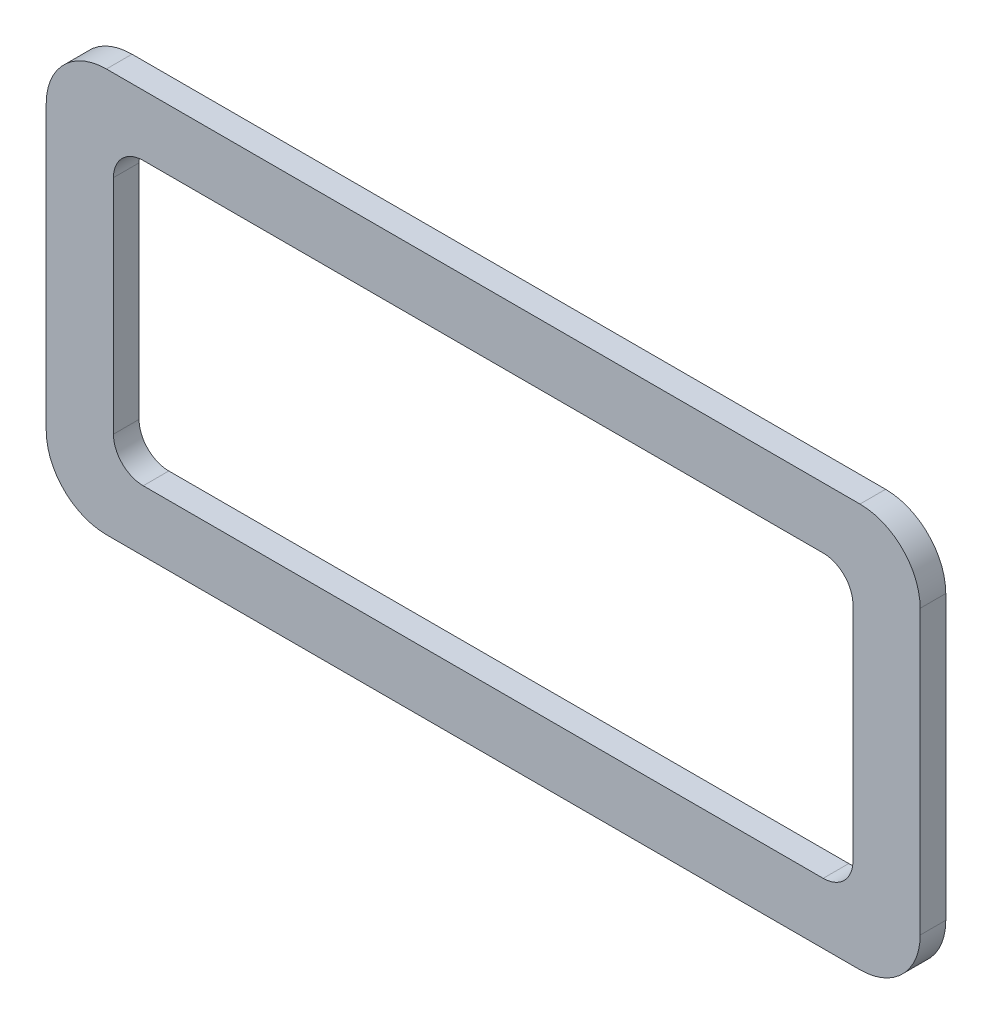
ISO-10303-21;
HEADER;
FILE_DESCRIPTION(('STEP AP214'),'2;1');
FILE_NAME('part.step','',(''),(''),'','','');
FILE_SCHEMA(('AUTOMOTIVE_DESIGN { 1 0 10303 214 1 1 1 1 }'));
ENDSEC;
DATA;
#1=APPLICATION_CONTEXT('core data for automotive mechanical design processes');
#2=APPLICATION_PROTOCOL_DEFINITION('international standard','automotive_design',2000,#1);
#3=PRODUCT_CONTEXT('',#1,'mechanical');
#4=PRODUCT('Part','Part','',(#3));
#5=PRODUCT_RELATED_PRODUCT_CATEGORY('part','',(#4));
#6=PRODUCT_DEFINITION_FORMATION('','',#4);
#7=PRODUCT_DEFINITION_CONTEXT('part definition',#1,'design');
#8=PRODUCT_DEFINITION('design','',#6,#7);
#9=PRODUCT_DEFINITION_SHAPE('','',#8);
#10=(LENGTH_UNIT() NAMED_UNIT(*) SI_UNIT(.MILLI.,.METRE.));
#11=(NAMED_UNIT(*) PLANE_ANGLE_UNIT() SI_UNIT($,.RADIAN.));
#12=(NAMED_UNIT(*) SI_UNIT($,.STERADIAN.) SOLID_ANGLE_UNIT());
#13=UNCERTAINTY_MEASURE_WITH_UNIT(LENGTH_MEASURE(1.E-05),#10,'distance_accuracy_value','');
#14=(GEOMETRIC_REPRESENTATION_CONTEXT(3) GLOBAL_UNCERTAINTY_ASSIGNED_CONTEXT((#13)) GLOBAL_UNIT_ASSIGNED_CONTEXT((#10,
#11,#12)) REPRESENTATION_CONTEXT('',''));
#15=CARTESIAN_POINT('',(0.,0.,0.));
#16=DIRECTION('',(0.,0.,1.));
#17=DIRECTION('',(1.,0.,0.));
#18=AXIS2_PLACEMENT_3D('',#15,#16,#17);
#19=CARTESIAN_POINT('',(-29.8958,11.2268,2.032));
#20=DIRECTION('',(0.,0.,-1.));
#21=DIRECTION('',(-1.,0.,0.));
#22=AXIS2_PLACEMENT_3D('',#19,#20,#21);
#23=PLANE('',#22);
#24=DIRECTION('',(1.,0.,0.));
#25=VECTOR('',#24,1.);
#26=CARTESIAN_POINT('',(-26.9748,11.176,2.032));
#27=LINE('',#26,#25);
#28=CARTESIAN_POINT('',(26.9748,11.176,2.032));
#29=VERTEX_POINT('',#28);
#30=CARTESIAN_POINT('',(-26.9748,11.176,2.032));
#31=VERTEX_POINT('',#30);
#32=EDGE_CURVE('E150',#29,#31,#27,.F.);
#33=ORIENTED_EDGE('',*,*,#32,.F.);
#34=CARTESIAN_POINT('',(26.9748,8.81379999999998,2.032));
#35=DIRECTION('',(0.,0.,-1.));
#36=DIRECTION('',(-1.,0.,0.));
#37=AXIS2_PLACEMENT_3D('',#34,#35,#36);
#38=CIRCLE('',#37,2.36220000000001);
#39=CARTESIAN_POINT('',(29.337,8.81379999999998,2.032));
#40=VERTEX_POINT('',#39);
#41=EDGE_CURVE('E192',#29,#40,#38,.T.);
#42=ORIENTED_EDGE('',*,*,#41,.T.);
#43=DIRECTION('',(0.,1.,0.));
#44=VECTOR('',#43,1.);
#45=CARTESIAN_POINT('',(29.337,8.81379999999998,2.032));
#46=LINE('',#45,#44);
#47=CARTESIAN_POINT('',(29.337,-8.81379999999998,2.032));
#48=VERTEX_POINT('',#47);
#49=EDGE_CURVE('E220',#48,#40,#46,.T.);
#50=ORIENTED_EDGE('',*,*,#49,.F.);
#51=CARTESIAN_POINT('',(26.9748,-8.81379999999998,2.032));
#52=DIRECTION('',(0.,0.,-1.));
#53=DIRECTION('',(-1.,0.,0.));
#54=AXIS2_PLACEMENT_3D('',#51,#52,#53);
#55=CIRCLE('',#54,2.36220000000001);
#56=CARTESIAN_POINT('',(26.9748,-11.176,2.032));
#57=VERTEX_POINT('',#56);
#58=EDGE_CURVE('E195',#48,#57,#55,.T.);
#59=ORIENTED_EDGE('',*,*,#58,.T.);
#60=DIRECTION('',(-1.,0.,0.));
#61=VECTOR('',#60,1.);
#62=CARTESIAN_POINT('',(-26.9748,-11.176,2.032));
#63=LINE('',#62,#61);
#64=CARTESIAN_POINT('',(-26.9748,-11.176,2.032));
#65=VERTEX_POINT('',#64);
#66=EDGE_CURVE('E198',#65,#57,#63,.F.);
#67=ORIENTED_EDGE('',*,*,#66,.F.);
#68=CARTESIAN_POINT('',(-26.9748,-8.81380000000001,2.032));
#69=DIRECTION('',(0.,0.,-1.));
#70=DIRECTION('',(-1.,0.,0.));
#71=AXIS2_PLACEMENT_3D('',#68,#69,#70);
#72=CIRCLE('',#71,2.3622);
#73=CARTESIAN_POINT('',(-29.337,-8.81380000000001,2.032));
#74=VERTEX_POINT('',#73);
#75=EDGE_CURVE('E199',#65,#74,#72,.T.);
#76=ORIENTED_EDGE('',*,*,#75,.T.);
#77=DIRECTION('',(0.,1.,0.));
#78=VECTOR('',#77,1.);
#79=CARTESIAN_POINT('',(-29.337,8.81380000000001,2.032));
#80=LINE('',#79,#78);
#81=CARTESIAN_POINT('',(-29.337,8.81380000000001,2.032));
#82=VERTEX_POINT('',#81);
#83=EDGE_CURVE('E154',#82,#74,#80,.F.);
#84=ORIENTED_EDGE('',*,*,#83,.F.);
#85=CARTESIAN_POINT('',(-26.9748,8.81380000000001,2.032));
#86=DIRECTION('',(0.,0.,-1.));
#87=DIRECTION('',(-1.,0.,0.));
#88=AXIS2_PLACEMENT_3D('',#85,#86,#87);
#89=CIRCLE('',#88,2.3622);
#90=EDGE_CURVE('E202',#82,#31,#89,.T.);
#91=ORIENTED_EDGE('',*,*,#90,.T.);
#92=EDGE_LOOP('',(#33,#42,#50,#59,#67,#76,#84,#91));
#93=FACE_BOUND('',#92,.T.);
#94=DIRECTION('',(0.,1.,0.));
#95=VECTOR('',#94,1.);
#96=CARTESIAN_POINT('',(-34.671,11.2268,2.032));
#97=LINE('',#96,#95);
#98=CARTESIAN_POINT('',(-34.671,11.2268,2.032));
#99=VERTEX_POINT('',#98);
#100=CARTESIAN_POINT('',(-34.671,-11.2268,2.032));
#101=VERTEX_POINT('',#100);
#102=EDGE_CURVE('E130',#99,#101,#97,.F.);
#103=ORIENTED_EDGE('',*,*,#102,.T.);
#104=CARTESIAN_POINT('',(-29.8958,-11.2268,2.032));
#105=DIRECTION('',(0.,0.,-1.));
#106=DIRECTION('',(-1.,0.,0.));
#107=AXIS2_PLACEMENT_3D('',#104,#105,#106);
#108=CIRCLE('',#107,4.7752);
#109=CARTESIAN_POINT('',(-29.8958,-16.002,2.032));
#110=VERTEX_POINT('',#109);
#111=EDGE_CURVE('E144',#110,#101,#108,.T.);
#112=ORIENTED_EDGE('',*,*,#111,.F.);
#113=DIRECTION('',(-1.,0.,0.));
#114=VECTOR('',#113,1.);
#115=CARTESIAN_POINT('',(-29.8958,-16.002,2.032));
#116=LINE('',#115,#114);
#117=CARTESIAN_POINT('',(29.8958,-16.002,2.032));
#118=VERTEX_POINT('',#117);
#119=EDGE_CURVE('E156',#110,#118,#116,.F.);
#120=ORIENTED_EDGE('',*,*,#119,.T.);
#121=CARTESIAN_POINT('',(29.8958,-11.2268,2.032));
#122=DIRECTION('',(0.,0.,-1.));
#123=DIRECTION('',(-1.,0.,0.));
#124=AXIS2_PLACEMENT_3D('',#121,#122,#123);
#125=CIRCLE('',#124,4.77520000000001);
#126=CARTESIAN_POINT('',(34.671,-11.2268,2.032));
#127=VERTEX_POINT('',#126);
#128=EDGE_CURVE('E159',#127,#118,#125,.T.);
#129=ORIENTED_EDGE('',*,*,#128,.F.);
#130=DIRECTION('',(0.,1.,0.));
#131=VECTOR('',#130,1.);
#132=CARTESIAN_POINT('',(34.671,11.2268,2.032));
#133=LINE('',#132,#131);
#134=CARTESIAN_POINT('',(34.671,11.2268,2.032));
#135=VERTEX_POINT('',#134);
#136=EDGE_CURVE('E160',#127,#135,#133,.T.);
#137=ORIENTED_EDGE('',*,*,#136,.T.);
#138=CARTESIAN_POINT('',(29.8958,11.2268,2.032));
#139=DIRECTION('',(0.,0.,-1.));
#140=DIRECTION('',(-1.,0.,0.));
#141=AXIS2_PLACEMENT_3D('',#138,#139,#140);
#142=CIRCLE('',#141,4.77520000000001);
#143=CARTESIAN_POINT('',(29.8958,16.002,2.032));
#144=VERTEX_POINT('',#143);
#145=EDGE_CURVE('E163',#144,#135,#142,.T.);
#146=ORIENTED_EDGE('',*,*,#145,.F.);
#147=DIRECTION('',(1.,0.,0.));
#148=VECTOR('',#147,1.);
#149=CARTESIAN_POINT('',(-29.8958,16.002,2.032));
#150=LINE('',#149,#148);
#151=CARTESIAN_POINT('',(-29.8958,16.002,2.032));
#152=VERTEX_POINT('',#151);
#153=EDGE_CURVE('E133',#144,#152,#150,.F.);
#154=ORIENTED_EDGE('',*,*,#153,.T.);
#155=CARTESIAN_POINT('',(-29.8958,11.2268,2.032));
#156=DIRECTION('',(0.,0.,-1.));
#157=DIRECTION('',(-1.,0.,0.));
#158=AXIS2_PLACEMENT_3D('',#155,#156,#157);
#159=CIRCLE('',#158,4.7752);
#160=EDGE_CURVE('E19',#99,#152,#159,.T.);
#161=ORIENTED_EDGE('',*,*,#160,.F.);
#162=EDGE_LOOP('',(#103,#112,#120,#129,#137,#146,#154,#161));
#163=FACE_BOUND('',#162,.T.);
#164=ADVANCED_FACE('F16',(#93,#163),#23,.F.);
#165=CARTESIAN_POINT('',(-29.8958,11.2268,2.032));
#166=DIRECTION('',(0.,0.,-1.));
#167=DIRECTION('',(-1.,0.,0.));
#168=AXIS2_PLACEMENT_3D('',#165,#166,#167);
#169=CYLINDRICAL_SURFACE('',#168,4.7752);
#170=ORIENTED_EDGE('',*,*,#160,.T.);
#171=DIRECTION('',(0.,0.,1.));
#172=VECTOR('',#171,1.);
#173=CARTESIAN_POINT('',(-29.8958,16.002,2.032));
#174=LINE('',#173,#172);
#175=CARTESIAN_POINT('',(-29.8958,16.002,0.));
#176=VERTEX_POINT('',#175);
#177=EDGE_CURVE('E164',#152,#176,#174,.F.);
#178=ORIENTED_EDGE('',*,*,#177,.T.);
#179=CARTESIAN_POINT('',(-29.8958,11.2268,0.));
#180=DIRECTION('',(0.,0.,-1.));
#181=DIRECTION('',(-1.,0.,0.));
#182=AXIS2_PLACEMENT_3D('',#179,#180,#181);
#183=CIRCLE('',#182,4.7752);
#184=CARTESIAN_POINT('',(-34.671,11.2268,0.));
#185=VERTEX_POINT('',#184);
#186=EDGE_CURVE('E140',#185,#176,#183,.T.);
#187=ORIENTED_EDGE('',*,*,#186,.F.);
#188=DIRECTION('',(0.,0.,-1.));
#189=VECTOR('',#188,1.);
#190=CARTESIAN_POINT('',(-34.671,11.2268,2.032));
#191=LINE('',#190,#189);
#192=EDGE_CURVE('E137',#185,#99,#191,.F.);
#193=ORIENTED_EDGE('',*,*,#192,.T.);
#194=EDGE_LOOP('',(#170,#178,#187,#193));
#195=FACE_BOUND('',#194,.T.);
#196=ADVANCED_FACE('F138',(#195),#169,.T.);
#197=CARTESIAN_POINT('',(-29.8958,16.002,2.032));
#198=DIRECTION('',(0.,-1.,0.));
#199=DIRECTION('',(1.,0.,0.));
#200=AXIS2_PLACEMENT_3D('',#197,#198,#199);
#201=PLANE('',#200);
#202=ORIENTED_EDGE('',*,*,#177,.F.);
#203=ORIENTED_EDGE('',*,*,#153,.F.);
#204=DIRECTION('',(0.,0.,-1.));
#205=VECTOR('',#204,1.);
#206=CARTESIAN_POINT('',(29.8958,16.002,2.032));
#207=LINE('',#206,#205);
#208=CARTESIAN_POINT('',(29.8958,16.002,0.));
#209=VERTEX_POINT('',#208);
#210=EDGE_CURVE('E210',#209,#144,#207,.F.);
#211=ORIENTED_EDGE('',*,*,#210,.F.);
#212=DIRECTION('',(-1.,0.,0.));
#213=VECTOR('',#212,1.);
#214=CARTESIAN_POINT('',(-29.8958,16.002,0.));
#215=LINE('',#214,#213);
#216=EDGE_CURVE('E190',#176,#209,#215,.F.);
#217=ORIENTED_EDGE('',*,*,#216,.F.);
#218=EDGE_LOOP('',(#202,#203,#211,#217));
#219=FACE_BOUND('',#218,.T.);
#220=ADVANCED_FACE('F393',(#219),#201,.F.);
#221=CARTESIAN_POINT('',(29.8958,11.2268,2.032));
#222=DIRECTION('',(0.,0.,-1.));
#223=DIRECTION('',(-1.,0.,0.));
#224=AXIS2_PLACEMENT_3D('',#221,#222,#223);
#225=CYLINDRICAL_SURFACE('',#224,4.77520000000001);
#226=ORIENTED_EDGE('',*,*,#145,.T.);
#227=DIRECTION('',(0.,0.,1.));
#228=VECTOR('',#227,1.);
#229=CARTESIAN_POINT('',(34.671,11.2268,2.032));
#230=LINE('',#229,#228);
#231=CARTESIAN_POINT('',(34.671,11.2268,0.));
#232=VERTEX_POINT('',#231);
#233=EDGE_CURVE('E162',#135,#232,#230,.F.);
#234=ORIENTED_EDGE('',*,*,#233,.T.);
#235=CARTESIAN_POINT('',(29.8958,11.2268,0.));
#236=DIRECTION('',(0.,0.,-1.));
#237=DIRECTION('',(-1.,0.,0.));
#238=AXIS2_PLACEMENT_3D('',#235,#236,#237);
#239=CIRCLE('',#238,4.77520000000001);
#240=EDGE_CURVE('E187',#209,#232,#239,.T.);
#241=ORIENTED_EDGE('',*,*,#240,.F.);
#242=ORIENTED_EDGE('',*,*,#210,.T.);
#243=EDGE_LOOP('',(#226,#234,#241,#242));
#244=FACE_BOUND('',#243,.T.);
#245=ADVANCED_FACE('F246',(#244),#225,.T.);
#246=CARTESIAN_POINT('',(34.671,11.2268,2.032));
#247=DIRECTION('',(-1.,0.,0.));
#248=DIRECTION('',(0.,0.,1.));
#249=AXIS2_PLACEMENT_3D('',#246,#247,#248);
#250=PLANE('',#249);
#251=ORIENTED_EDGE('',*,*,#233,.F.);
#252=ORIENTED_EDGE('',*,*,#136,.F.);
#253=DIRECTION('',(0.,0.,-1.));
#254=VECTOR('',#253,1.);
#255=CARTESIAN_POINT('',(34.671,-11.2268,2.032));
#256=LINE('',#255,#254);
#257=CARTESIAN_POINT('',(34.671,-11.2268,0.));
#258=VERTEX_POINT('',#257);
#259=EDGE_CURVE('E208',#258,#127,#256,.F.);
#260=ORIENTED_EDGE('',*,*,#259,.F.);
#261=DIRECTION('',(0.,1.,0.));
#262=VECTOR('',#261,1.);
#263=CARTESIAN_POINT('',(34.671,11.2268,0.));
#264=LINE('',#263,#262);
#265=EDGE_CURVE('E186',#232,#258,#264,.F.);
#266=ORIENTED_EDGE('',*,*,#265,.F.);
#267=EDGE_LOOP('',(#251,#252,#260,#266));
#268=FACE_BOUND('',#267,.T.);
#269=ADVANCED_FACE('F250',(#268),#250,.F.);
#270=CARTESIAN_POINT('',(29.8958,-11.2268,2.032));
#271=DIRECTION('',(0.,0.,-1.));
#272=DIRECTION('',(-1.,0.,0.));
#273=AXIS2_PLACEMENT_3D('',#270,#271,#272);
#274=CYLINDRICAL_SURFACE('',#273,4.77520000000001);
#275=ORIENTED_EDGE('',*,*,#128,.T.);
#276=DIRECTION('',(0.,0.,1.));
#277=VECTOR('',#276,1.);
#278=CARTESIAN_POINT('',(29.8958,-16.002,2.032));
#279=LINE('',#278,#277);
#280=CARTESIAN_POINT('',(29.8958,-16.002,0.));
#281=VERTEX_POINT('',#280);
#282=EDGE_CURVE('E158',#118,#281,#279,.F.);
#283=ORIENTED_EDGE('',*,*,#282,.T.);
#284=CARTESIAN_POINT('',(29.8958,-11.2268,0.));
#285=DIRECTION('',(0.,0.,-1.));
#286=DIRECTION('',(-1.,0.,0.));
#287=AXIS2_PLACEMENT_3D('',#284,#285,#286);
#288=CIRCLE('',#287,4.77520000000001);
#289=EDGE_CURVE('E183',#258,#281,#288,.T.);
#290=ORIENTED_EDGE('',*,*,#289,.F.);
#291=ORIENTED_EDGE('',*,*,#259,.T.);
#292=EDGE_LOOP('',(#275,#283,#290,#291));
#293=FACE_BOUND('',#292,.T.);
#294=ADVANCED_FACE('F286',(#293),#274,.T.);
#295=CARTESIAN_POINT('',(-29.8958,-16.002,2.032));
#296=DIRECTION('',(0.,1.,0.));
#297=DIRECTION('',(-1.,0.,0.));
#298=AXIS2_PLACEMENT_3D('',#295,#296,#297);
#299=PLANE('',#298);
#300=ORIENTED_EDGE('',*,*,#282,.F.);
#301=ORIENTED_EDGE('',*,*,#119,.F.);
#302=DIRECTION('',(0.,0.,-1.));
#303=VECTOR('',#302,1.);
#304=CARTESIAN_POINT('',(-29.8958,-16.002,2.032));
#305=LINE('',#304,#303);
#306=CARTESIAN_POINT('',(-29.8958,-16.002,0.));
#307=VERTEX_POINT('',#306);
#308=EDGE_CURVE('E206',#307,#110,#305,.F.);
#309=ORIENTED_EDGE('',*,*,#308,.F.);
#310=DIRECTION('',(-1.,0.,0.));
#311=VECTOR('',#310,1.);
#312=CARTESIAN_POINT('',(-29.8958,-16.002,0.));
#313=LINE('',#312,#311);
#314=EDGE_CURVE('E182',#281,#307,#313,.T.);
#315=ORIENTED_EDGE('',*,*,#314,.F.);
#316=EDGE_LOOP('',(#300,#301,#309,#315));
#317=FACE_BOUND('',#316,.T.);
#318=ADVANCED_FACE('F282',(#317),#299,.F.);
#319=CARTESIAN_POINT('',(-29.8958,-11.2268,2.032));
#320=DIRECTION('',(0.,0.,-1.));
#321=DIRECTION('',(-1.,0.,0.));
#322=AXIS2_PLACEMENT_3D('',#319,#320,#321);
#323=CYLINDRICAL_SURFACE('',#322,4.7752);
#324=ORIENTED_EDGE('',*,*,#111,.T.);
#325=DIRECTION('',(0.,0.,-1.));
#326=VECTOR('',#325,1.);
#327=CARTESIAN_POINT('',(-34.671,-11.2268,2.032));
#328=LINE('',#327,#326);
#329=CARTESIAN_POINT('',(-34.671,-11.2268,0.));
#330=VERTEX_POINT('',#329);
#331=EDGE_CURVE('E148',#101,#330,#328,.T.);
#332=ORIENTED_EDGE('',*,*,#331,.T.);
#333=CARTESIAN_POINT('',(-29.8958,-11.2268,0.));
#334=DIRECTION('',(0.,0.,-1.));
#335=DIRECTION('',(-1.,0.,0.));
#336=AXIS2_PLACEMENT_3D('',#333,#334,#335);
#337=CIRCLE('',#336,4.7752);
#338=EDGE_CURVE('E178',#307,#330,#337,.T.);
#339=ORIENTED_EDGE('',*,*,#338,.F.);
#340=ORIENTED_EDGE('',*,*,#308,.T.);
#341=EDGE_LOOP('',(#324,#332,#339,#340));
#342=FACE_BOUND('',#341,.T.);
#343=ADVANCED_FACE('F284',(#342),#323,.T.);
#344=CARTESIAN_POINT('',(-34.671,11.2268,2.032));
#345=DIRECTION('',(1.,0.,0.));
#346=DIRECTION('',(0.,0.,-1.));
#347=AXIS2_PLACEMENT_3D('',#344,#345,#346);
#348=PLANE('',#347);
#349=ORIENTED_EDGE('',*,*,#331,.F.);
#350=ORIENTED_EDGE('',*,*,#102,.F.);
#351=ORIENTED_EDGE('',*,*,#192,.F.);
#352=DIRECTION('',(0.,1.,0.));
#353=VECTOR('',#352,1.);
#354=CARTESIAN_POINT('',(-34.671,11.2268,0.));
#355=LINE('',#354,#353);
#356=EDGE_CURVE('E181',#330,#185,#355,.T.);
#357=ORIENTED_EDGE('',*,*,#356,.F.);
#358=EDGE_LOOP('',(#349,#350,#351,#357));
#359=FACE_BOUND('',#358,.T.);
#360=ADVANCED_FACE('F147',(#359),#348,.F.);
#361=CARTESIAN_POINT('',(-26.9748,11.176,2.032));
#362=DIRECTION('',(0.,-1.,0.));
#363=DIRECTION('',(1.,0.,0.));
#364=AXIS2_PLACEMENT_3D('',#361,#362,#363);
#365=PLANE('',#364);
#366=ORIENTED_EDGE('',*,*,#32,.T.);
#367=DIRECTION('',(0.,0.,-1.));
#368=VECTOR('',#367,1.);
#369=CARTESIAN_POINT('',(-26.9748,11.176,2.032));
#370=LINE('',#369,#368);
#371=CARTESIAN_POINT('',(-26.9748,11.176,0.));
#372=VERTEX_POINT('',#371);
#373=EDGE_CURVE('E204',#31,#372,#370,.T.);
#374=ORIENTED_EDGE('',*,*,#373,.T.);
#375=DIRECTION('',(-1.,0.,0.));
#376=VECTOR('',#375,1.);
#377=CARTESIAN_POINT('',(-29.8958,11.176,0.));
#378=LINE('',#377,#376);
#379=CARTESIAN_POINT('',(26.9748,11.176,0.));
#380=VERTEX_POINT('',#379);
#381=EDGE_CURVE('E177',#380,#372,#378,.T.);
#382=ORIENTED_EDGE('',*,*,#381,.F.);
#383=DIRECTION('',(0.,0.,-1.));
#384=VECTOR('',#383,1.);
#385=CARTESIAN_POINT('',(26.9748,11.176,2.032));
#386=LINE('',#385,#384);
#387=EDGE_CURVE('E194',#380,#29,#386,.F.);
#388=ORIENTED_EDGE('',*,*,#387,.T.);
#389=EDGE_LOOP('',(#366,#374,#382,#388));
#390=FACE_BOUND('',#389,.T.);
#391=ADVANCED_FACE('F323',(#390),#365,.T.);
#392=CARTESIAN_POINT('',(-26.9748,8.81380000000001,2.032));
#393=DIRECTION('',(0.,0.,-1.));
#394=DIRECTION('',(-1.,0.,0.));
#395=AXIS2_PLACEMENT_3D('',#392,#393,#394);
#396=CYLINDRICAL_SURFACE('',#395,2.3622);
#397=ORIENTED_EDGE('',*,*,#373,.F.);
#398=ORIENTED_EDGE('',*,*,#90,.F.);
#399=DIRECTION('',(0.,0.,-1.));
#400=VECTOR('',#399,1.);
#401=CARTESIAN_POINT('',(-29.337,8.81380000000001,2.032));
#402=LINE('',#401,#400);
#403=CARTESIAN_POINT('',(-29.337,8.81380000000001,0.));
#404=VERTEX_POINT('',#403);
#405=EDGE_CURVE('E236',#404,#82,#402,.F.);
#406=ORIENTED_EDGE('',*,*,#405,.F.);
#407=CARTESIAN_POINT('',(-26.9748,8.81380000000001,0.));
#408=DIRECTION('',(0.,0.,-1.));
#409=DIRECTION('',(-1.,0.,0.));
#410=AXIS2_PLACEMENT_3D('',#407,#408,#409);
#411=CIRCLE('',#410,2.3622);
#412=EDGE_CURVE('E174',#372,#404,#411,.F.);
#413=ORIENTED_EDGE('',*,*,#412,.F.);
#414=EDGE_LOOP('',(#397,#398,#406,#413));
#415=FACE_BOUND('',#414,.T.);
#416=ADVANCED_FACE('F319',(#415),#396,.F.);
#417=CARTESIAN_POINT('',(-29.337,8.81380000000001,2.032));
#418=DIRECTION('',(1.,0.,0.));
#419=DIRECTION('',(0.,0.,-1.));
#420=AXIS2_PLACEMENT_3D('',#417,#418,#419);
#421=PLANE('',#420);
#422=ORIENTED_EDGE('',*,*,#83,.T.);
#423=DIRECTION('',(0.,0.,-1.));
#424=VECTOR('',#423,1.);
#425=CARTESIAN_POINT('',(-29.337,-8.81380000000001,2.032));
#426=LINE('',#425,#424);
#427=CARTESIAN_POINT('',(-29.337,-8.81380000000001,0.));
#428=VERTEX_POINT('',#427);
#429=EDGE_CURVE('E201',#74,#428,#426,.T.);
#430=ORIENTED_EDGE('',*,*,#429,.T.);
#431=DIRECTION('',(0.,1.,0.));
#432=VECTOR('',#431,1.);
#433=CARTESIAN_POINT('',(-29.337,11.2268,0.));
#434=LINE('',#433,#432);
#435=EDGE_CURVE('E173',#404,#428,#434,.F.);
#436=ORIENTED_EDGE('',*,*,#435,.F.);
#437=ORIENTED_EDGE('',*,*,#405,.T.);
#438=EDGE_LOOP('',(#422,#430,#436,#437));
#439=FACE_BOUND('',#438,.T.);
#440=ADVANCED_FACE('F315',(#439),#421,.T.);
#441=CARTESIAN_POINT('',(-26.9748,-8.81380000000001,2.032));
#442=DIRECTION('',(0.,0.,-1.));
#443=DIRECTION('',(-1.,0.,0.));
#444=AXIS2_PLACEMENT_3D('',#441,#442,#443);
#445=CYLINDRICAL_SURFACE('',#444,2.3622);
#446=ORIENTED_EDGE('',*,*,#429,.F.);
#447=ORIENTED_EDGE('',*,*,#75,.F.);
#448=DIRECTION('',(0.,0.,1.));
#449=VECTOR('',#448,1.);
#450=CARTESIAN_POINT('',(-26.9748,-11.176,2.032));
#451=LINE('',#450,#449);
#452=CARTESIAN_POINT('',(-26.9748,-11.176,0.));
#453=VERTEX_POINT('',#452);
#454=EDGE_CURVE('E225',#453,#65,#451,.T.);
#455=ORIENTED_EDGE('',*,*,#454,.F.);
#456=CARTESIAN_POINT('',(-26.9748,-8.81380000000001,0.));
#457=DIRECTION('',(0.,0.,-1.));
#458=DIRECTION('',(-1.,0.,0.));
#459=AXIS2_PLACEMENT_3D('',#456,#457,#458);
#460=CIRCLE('',#459,2.3622);
#461=EDGE_CURVE('E170',#428,#453,#460,.F.);
#462=ORIENTED_EDGE('',*,*,#461,.F.);
#463=EDGE_LOOP('',(#446,#447,#455,#462));
#464=FACE_BOUND('',#463,.T.);
#465=ADVANCED_FACE('F312',(#464),#445,.F.);
#466=CARTESIAN_POINT('',(-26.9748,-11.176,2.032));
#467=DIRECTION('',(0.,1.,0.));
#468=DIRECTION('',(-1.,0.,0.));
#469=AXIS2_PLACEMENT_3D('',#466,#467,#468);
#470=PLANE('',#469);
#471=ORIENTED_EDGE('',*,*,#66,.T.);
#472=DIRECTION('',(0.,0.,-1.));
#473=VECTOR('',#472,1.);
#474=CARTESIAN_POINT('',(26.9748,-11.176,2.032));
#475=LINE('',#474,#473);
#476=CARTESIAN_POINT('',(26.9748,-11.176,0.));
#477=VERTEX_POINT('',#476);
#478=EDGE_CURVE('E197',#57,#477,#475,.T.);
#479=ORIENTED_EDGE('',*,*,#478,.T.);
#480=DIRECTION('',(-1.,0.,0.));
#481=VECTOR('',#480,1.);
#482=CARTESIAN_POINT('',(-29.8958,-11.176,0.));
#483=LINE('',#482,#481);
#484=EDGE_CURVE('E169',#453,#477,#483,.F.);
#485=ORIENTED_EDGE('',*,*,#484,.F.);
#486=ORIENTED_EDGE('',*,*,#454,.T.);
#487=EDGE_LOOP('',(#471,#479,#485,#486));
#488=FACE_BOUND('',#487,.T.);
#489=ADVANCED_FACE('F263',(#488),#470,.T.);
#490=CARTESIAN_POINT('',(26.9748,-8.81379999999998,2.032));
#491=DIRECTION('',(0.,0.,-1.));
#492=DIRECTION('',(-1.,0.,0.));
#493=AXIS2_PLACEMENT_3D('',#490,#491,#492);
#494=CYLINDRICAL_SURFACE('',#493,2.36220000000001);
#495=ORIENTED_EDGE('',*,*,#478,.F.);
#496=ORIENTED_EDGE('',*,*,#58,.F.);
#497=DIRECTION('',(0.,0.,1.));
#498=VECTOR('',#497,1.);
#499=CARTESIAN_POINT('',(29.337,-8.81379999999998,2.032));
#500=LINE('',#499,#498);
#501=CARTESIAN_POINT('',(29.337,-8.81379999999998,0.));
#502=VERTEX_POINT('',#501);
#503=EDGE_CURVE('E222',#502,#48,#500,.T.);
#504=ORIENTED_EDGE('',*,*,#503,.F.);
#505=CARTESIAN_POINT('',(26.9748,-8.81379999999998,0.));
#506=DIRECTION('',(0.,0.,-1.));
#507=DIRECTION('',(-1.,0.,0.));
#508=AXIS2_PLACEMENT_3D('',#505,#506,#507);
#509=CIRCLE('',#508,2.36220000000001);
#510=EDGE_CURVE('E166',#477,#502,#509,.F.);
#511=ORIENTED_EDGE('',*,*,#510,.F.);
#512=EDGE_LOOP('',(#495,#496,#504,#511));
#513=FACE_BOUND('',#512,.T.);
#514=ADVANCED_FACE('F266',(#513),#494,.F.);
#515=CARTESIAN_POINT('',(29.337,8.81379999999998,2.032));
#516=DIRECTION('',(-1.,0.,0.));
#517=DIRECTION('',(0.,0.,1.));
#518=AXIS2_PLACEMENT_3D('',#515,#516,#517);
#519=PLANE('',#518);
#520=ORIENTED_EDGE('',*,*,#49,.T.);
#521=DIRECTION('',(0.,0.,-1.));
#522=VECTOR('',#521,1.);
#523=CARTESIAN_POINT('',(29.337,8.81379999999998,2.032));
#524=LINE('',#523,#522);
#525=CARTESIAN_POINT('',(29.337,8.81379999999998,0.));
#526=VERTEX_POINT('',#525);
#527=EDGE_CURVE('E34',#40,#526,#524,.T.);
#528=ORIENTED_EDGE('',*,*,#527,.T.);
#529=DIRECTION('',(0.,1.,0.));
#530=VECTOR('',#529,1.);
#531=CARTESIAN_POINT('',(29.337,11.2268,0.));
#532=LINE('',#531,#530);
#533=EDGE_CURVE('E25',#502,#526,#532,.T.);
#534=ORIENTED_EDGE('',*,*,#533,.F.);
#535=ORIENTED_EDGE('',*,*,#503,.T.);
#536=EDGE_LOOP('',(#520,#528,#534,#535));
#537=FACE_BOUND('',#536,.T.);
#538=ADVANCED_FACE('F302',(#537),#519,.T.);
#539=CARTESIAN_POINT('',(26.9748,8.81379999999998,2.032));
#540=DIRECTION('',(0.,0.,-1.));
#541=DIRECTION('',(-1.,0.,0.));
#542=AXIS2_PLACEMENT_3D('',#539,#540,#541);
#543=CYLINDRICAL_SURFACE('',#542,2.36220000000001);
#544=ORIENTED_EDGE('',*,*,#527,.F.);
#545=ORIENTED_EDGE('',*,*,#41,.F.);
#546=ORIENTED_EDGE('',*,*,#387,.F.);
#547=CARTESIAN_POINT('',(26.9748,8.81379999999998,0.));
#548=DIRECTION('',(0.,0.,-1.));
#549=DIRECTION('',(-1.,0.,0.));
#550=AXIS2_PLACEMENT_3D('',#547,#548,#549);
#551=CIRCLE('',#550,2.36220000000001);
#552=EDGE_CURVE('E11',#526,#380,#551,.F.);
#553=ORIENTED_EDGE('',*,*,#552,.F.);
#554=EDGE_LOOP('',(#544,#545,#546,#553));
#555=FACE_BOUND('',#554,.T.);
#556=ADVANCED_FACE('F297',(#555),#543,.F.);
#557=CARTESIAN_POINT('',(-29.8958,11.2268,0.));
#558=DIRECTION('',(0.,0.,-1.));
#559=DIRECTION('',(-1.,0.,0.));
#560=AXIS2_PLACEMENT_3D('',#557,#558,#559);
#561=PLANE('',#560);
#562=ORIENTED_EDGE('',*,*,#533,.T.);
#563=ORIENTED_EDGE('',*,*,#552,.T.);
#564=ORIENTED_EDGE('',*,*,#381,.T.);
#565=ORIENTED_EDGE('',*,*,#412,.T.);
#566=ORIENTED_EDGE('',*,*,#435,.T.);
#567=ORIENTED_EDGE('',*,*,#461,.T.);
#568=ORIENTED_EDGE('',*,*,#484,.T.);
#569=ORIENTED_EDGE('',*,*,#510,.T.);
#570=EDGE_LOOP('',(#562,#563,#564,#565,#566,#567,#568,#569));
#571=FACE_BOUND('',#570,.T.);
#572=ORIENTED_EDGE('',*,*,#338,.T.);
#573=ORIENTED_EDGE('',*,*,#356,.T.);
#574=ORIENTED_EDGE('',*,*,#186,.T.);
#575=ORIENTED_EDGE('',*,*,#216,.T.);
#576=ORIENTED_EDGE('',*,*,#240,.T.);
#577=ORIENTED_EDGE('',*,*,#265,.T.);
#578=ORIENTED_EDGE('',*,*,#289,.T.);
#579=ORIENTED_EDGE('',*,*,#314,.T.);
#580=EDGE_LOOP('',(#572,#573,#574,#575,#576,#577,#578,#579));
#581=FACE_BOUND('',#580,.T.);
#582=ADVANCED_FACE('F253',(#571,#581),#561,.T.);
#583=CLOSED_SHELL('',(#164,#196,#220,#245,#269,#294,#318,#343,#360,#391,#416,#440,#465,#489,
#514,#538,#556,#582));
#584=MANIFOLD_SOLID_BREP('B1',#583);
#585=ADVANCED_BREP_SHAPE_REPRESENTATION('',(#18,#584),#14);
#586=SHAPE_DEFINITION_REPRESENTATION(#9,#585);
ENDSEC;
END-ISO-10303-21;
